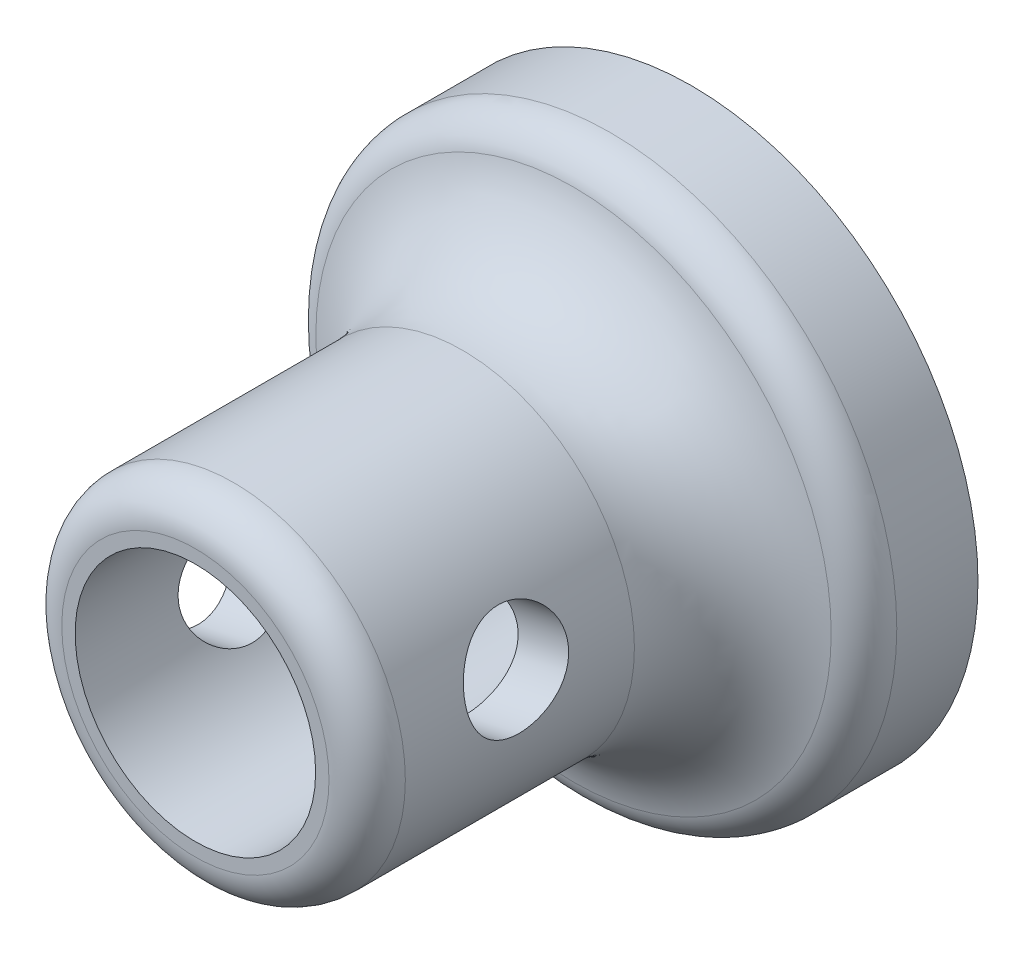
ISO-10303-21;
HEADER;
FILE_DESCRIPTION(('STEP AP214'),'2;1');
FILE_NAME('part.step','',(''),(''),'','','');
FILE_SCHEMA(('AUTOMOTIVE_DESIGN { 1 0 10303 214 1 1 1 1 }'));
ENDSEC;
DATA;
#1=APPLICATION_CONTEXT('core data for automotive mechanical design processes');
#2=APPLICATION_PROTOCOL_DEFINITION('international standard','automotive_design',2000,#1);
#3=PRODUCT_CONTEXT('',#1,'mechanical');
#4=PRODUCT('Part','Part','',(#3));
#5=PRODUCT_RELATED_PRODUCT_CATEGORY('part','',(#4));
#6=PRODUCT_DEFINITION_FORMATION('','',#4);
#7=PRODUCT_DEFINITION_CONTEXT('part definition',#1,'design');
#8=PRODUCT_DEFINITION('design','',#6,#7);
#9=PRODUCT_DEFINITION_SHAPE('','',#8);
#10=(LENGTH_UNIT() NAMED_UNIT(*) SI_UNIT(.MILLI.,.METRE.));
#11=(NAMED_UNIT(*) PLANE_ANGLE_UNIT() SI_UNIT($,.RADIAN.));
#12=(NAMED_UNIT(*) SI_UNIT($,.STERADIAN.) SOLID_ANGLE_UNIT());
#13=UNCERTAINTY_MEASURE_WITH_UNIT(LENGTH_MEASURE(1.E-05),#10,'distance_accuracy_value','');
#14=(GEOMETRIC_REPRESENTATION_CONTEXT(3) GLOBAL_UNCERTAINTY_ASSIGNED_CONTEXT((#13)) GLOBAL_UNIT_ASSIGNED_CONTEXT((#10,
#11,#12)) REPRESENTATION_CONTEXT('',''));
#15=CARTESIAN_POINT('',(0.,0.,0.));
#16=DIRECTION('',(0.,0.,1.));
#17=DIRECTION('',(1.,0.,0.));
#18=AXIS2_PLACEMENT_3D('',#15,#16,#17);
#19=CARTESIAN_POINT('',(18.1431082575943,29.9368359977339,3.));
#20=DIRECTION('',(0.,0.,-1.));
#21=DIRECTION('',(-1.,0.,0.));
#22=AXIS2_PLACEMENT_3D('',#19,#20,#21);
#23=CYLINDRICAL_SURFACE('',#22,7.5);
#24=CARTESIAN_POINT('',(18.1431082575943,29.9368359977339,2.12701665379258));
#25=DIRECTION('',(0.,0.,-1.));
#26=DIRECTION('',(-1.,0.,0.));
#27=AXIS2_PLACEMENT_3D('',#24,#25,#26);
#28=CIRCLE('',#27,7.5);
#29=CARTESIAN_POINT('',(10.6431082575943,29.9368359977339,2.12701665379258));
#30=VERTEX_POINT('',#29);
#31=EDGE_CURVE('E57',#30,#30,#28,.T.);
#32=ORIENTED_EDGE('',*,*,#31,.T.);
#33=EDGE_LOOP('',(#32));
#34=FACE_BOUND('',#33,.T.);
#35=CARTESIAN_POINT('',(18.1431082575943,29.9368359977339,0.));
#36=DIRECTION('',(0.,0.,1.));
#37=DIRECTION('',(1.,0.,0.));
#38=AXIS2_PLACEMENT_3D('',#35,#36,#37);
#39=CIRCLE('',#38,7.5);
#40=CARTESIAN_POINT('',(25.6431082575943,29.9368359977339,0.));
#41=VERTEX_POINT('',#40);
#42=EDGE_CURVE('E135',#41,#41,#39,.T.);
#43=ORIENTED_EDGE('',*,*,#42,.T.);
#44=EDGE_LOOP('',(#43));
#45=FACE_BOUND('',#44,.T.);
#46=ADVANCED_FACE('F39',(#34,#45),#23,.T.);
#47=CARTESIAN_POINT('',(18.1431082575943,29.9368359977339,0.));
#48=DIRECTION('',(0.,0.,1.));
#49=DIRECTION('',(1.,0.,0.));
#50=AXIS2_PLACEMENT_3D('',#47,#48,#49);
#51=PLANE('',#50);
#52=CARTESIAN_POINT('',(18.1431082575943,29.9368359977339,0.));
#53=DIRECTION('',(0.,0.,1.));
#54=DIRECTION('',(1.,0.,0.));
#55=AXIS2_PLACEMENT_3D('',#52,#53,#54);
#56=CIRCLE('',#55,1.65);
#57=CARTESIAN_POINT('',(19.7931082575943,29.9368359977339,0.));
#58=VERTEX_POINT('',#57);
#59=EDGE_CURVE('E141',#58,#58,#56,.F.);
#60=ORIENTED_EDGE('',*,*,#59,.F.);
#61=EDGE_LOOP('',(#60));
#62=FACE_BOUND('',#61,.T.);
#63=ORIENTED_EDGE('',*,*,#42,.F.);
#64=EDGE_LOOP('',(#63));
#65=FACE_BOUND('',#64,.T.);
#66=ADVANCED_FACE('F103',(#62,#65),#51,.F.);
#67=CARTESIAN_POINT('',(18.1431082575943,29.9368359977339,13.));
#68=DIRECTION('',(0.,0.,1.));
#69=DIRECTION('',(1.,0.,0.));
#70=AXIS2_PLACEMENT_3D('',#67,#68,#69);
#71=PLANE('',#70);
#72=CARTESIAN_POINT('',(18.1431082575943,29.9368359977339,13.));
#73=DIRECTION('',(0.,0.,1.));
#74=DIRECTION('',(1.,0.,0.));
#75=AXIS2_PLACEMENT_3D('',#72,#73,#74);
#76=CIRCLE('',#75,3.5);
#77=CARTESIAN_POINT('',(21.6431082575943,29.9368359977339,13.));
#78=VERTEX_POINT('',#77);
#79=EDGE_CURVE('E52',#78,#78,#76,.T.);
#80=ORIENTED_EDGE('',*,*,#79,.T.);
#81=EDGE_LOOP('',(#80));
#82=FACE_BOUND('',#81,.T.);
#83=CARTESIAN_POINT('',(18.1431082575943,29.9368359977339,13.));
#84=DIRECTION('',(0.,0.,1.));
#85=DIRECTION('',(1.,0.,0.));
#86=AXIS2_PLACEMENT_3D('',#83,#84,#85);
#87=CIRCLE('',#86,3.15);
#88=CARTESIAN_POINT('',(21.2931082575943,29.9368359977339,13.));
#89=VERTEX_POINT('',#88);
#90=EDGE_CURVE('E138',#89,#89,#87,.T.);
#91=ORIENTED_EDGE('',*,*,#90,.F.);
#92=EDGE_LOOP('',(#91));
#93=FACE_BOUND('',#92,.T.);
#94=ADVANCED_FACE('F95',(#82,#93),#71,.T.);
#95=CARTESIAN_POINT('',(18.1431082575943,29.9368359977339,13.));
#96=DIRECTION('',(0.,0.,-1.));
#97=DIRECTION('',(-1.,0.,0.));
#98=AXIS2_PLACEMENT_3D('',#95,#96,#97);
#99=CYLINDRICAL_SURFACE('',#98,4.5);
#100=CARTESIAN_POINT('',(22.620113793116,29.4824997402025,9.));
#101=CARTESIAN_POINT('',(22.6201143562412,29.4825007971587,9.07397509314816));
#102=CARTESIAN_POINT('',(22.6207736410553,29.4888655882915,9.14795930172962));
#103=CARTESIAN_POINT('',(22.6232213520881,29.5140568813195,9.29376472463275));
#104=CARTESIAN_POINT('',(22.6250101555754,29.5328875470225,9.36558520785132));
#105=CARTESIAN_POINT('',(22.629181332351,29.582216780074,9.50493125544456));
#106=CARTESIAN_POINT('',(22.6315627160945,29.6126959407143,9.57246374666978));
#107=CARTESIAN_POINT('',(22.6361563187062,29.6842503923314,9.70165974059577));
#108=CARTESIAN_POINT('',(22.6383685121861,29.7253272695483,9.763322362816));
#109=CARTESIAN_POINT('',(22.6417880907802,29.8181279539382,9.88097975151964));
#110=CARTESIAN_POINT('',(22.6429648462821,29.8701232696044,9.93676130815166));
#111=CARTESIAN_POINT('',(22.6432269896913,29.9824720933915,10.0391741561903));
#112=CARTESIAN_POINT('',(22.6423121089612,30.0428266741915,10.0858042714049));
#113=CARTESIAN_POINT('',(22.6374540341031,30.1715307361078,10.16951642985));
#114=CARTESIAN_POINT('',(22.6334486070153,30.2400197379852,10.2063810819985));
#115=CARTESIAN_POINT('',(22.621609053002,30.3819092480203,10.2680885331385));
#116=CARTESIAN_POINT('',(22.6137757525421,30.4553086930267,10.2929339248717));
#117=CARTESIAN_POINT('',(22.5941896931129,30.6025933256329,10.3291920009815));
#118=CARTESIAN_POINT('',(22.5825554658496,30.6764045532954,10.3409686148874));
#119=CARTESIAN_POINT('',(22.5553824982554,30.8242362165451,10.3519055921818));
#120=CARTESIAN_POINT('',(22.5398445786947,30.8982566049246,10.3510686054618));
#121=CARTESIAN_POINT('',(22.50591236693,31.0419237464229,10.3370464183113));
#122=CARTESIAN_POINT('',(22.4876248022935,31.1116347127572,10.3242553255711));
#123=CARTESIAN_POINT('',(22.4486549446758,31.2472749146427,10.2873317976051));
#124=CARTESIAN_POINT('',(22.4279725001029,31.3132039104066,10.2631986441516));
#125=CARTESIAN_POINT('',(22.3850212387639,31.4404109462665,10.2040091789233));
#126=CARTESIAN_POINT('',(22.3627367510017,31.5016258724203,10.1688289174735));
#127=CARTESIAN_POINT('',(22.3180599030227,31.6172000941239,10.0886419328146));
#128=CARTESIAN_POINT('',(22.2956675184485,31.6715577583788,10.0436328783329));
#129=CARTESIAN_POINT('',(22.2512900846311,31.7742510530419,9.94302202432357));
#130=CARTESIAN_POINT('',(22.2293540124488,31.822273767797,9.88707877287324));
#131=CARTESIAN_POINT('',(22.1883673209859,31.908680871256,9.76724098389895));
#132=CARTESIAN_POINT('',(22.1693169885249,31.9470643021403,9.7033456571497));
#133=CARTESIAN_POINT('',(22.1354097419241,32.0135985392966,9.56858447767591));
#134=CARTESIAN_POINT('',(22.1205947908925,32.0416476937818,9.49765765872337));
#135=CARTESIAN_POINT('',(22.0967009765957,32.0861965960057,9.35135351239901));
#136=CARTESIAN_POINT('',(22.0876202421538,32.1027001114811,9.2759776456189));
#137=CARTESIAN_POINT('',(22.0762640613854,32.1232529344876,9.12592587533465));
#138=CARTESIAN_POINT('',(22.0737475791079,32.1277435162817,9.05132859849541));
#139=CARTESIAN_POINT('',(22.0750515109018,32.1254027916992,8.90237438999112));
#140=CARTESIAN_POINT('',(22.0788710379262,32.118573070175,8.82801742614224));
#141=CARTESIAN_POINT('',(22.0923160214354,32.0941356786662,8.68366045982622));
#142=CARTESIAN_POINT('',(22.1017880698055,32.076812614811,8.61359745216283));
#143=CARTESIAN_POINT('',(22.1256258689326,32.0321142118936,8.47763847826657));
#144=CARTESIAN_POINT('',(22.1399923752596,32.0047373207452,8.41174315727348));
#145=CARTESIAN_POINT('',(22.17296998291,31.9397272062051,8.28403428233508));
#146=CARTESIAN_POINT('',(22.1916846588522,31.9018384270169,8.22237775111279));
#147=CARTESIAN_POINT('',(22.2317768379106,31.816992096829,8.10662570443728));
#148=CARTESIAN_POINT('',(22.2531549779676,31.77003237512,8.05253200414849));
#149=CARTESIAN_POINT('',(22.2979915212476,31.6660736604892,7.95133763476674));
#150=CARTESIAN_POINT('',(22.3214979847729,31.6087626675275,7.90457793391171));
#151=CARTESIAN_POINT('',(22.3682974174728,31.4866886329818,7.82192996907502));
#152=CARTESIAN_POINT('',(22.3915903971942,31.4219259617016,7.78604116519668));
#153=CARTESIAN_POINT('',(22.4363501774861,31.2870503327077,7.72649997248853));
#154=CARTESIAN_POINT('',(22.4578295713196,31.2169820350454,7.70275618545692));
#155=CARTESIAN_POINT('',(22.4979581021844,31.0729962192332,7.66794517299862));
#156=CARTESIAN_POINT('',(22.5166080476623,30.999079808727,7.65687432064642));
#157=CARTESIAN_POINT('',(22.54957646903,30.8525128917909,7.64799926035095));
#158=CARTESIAN_POINT('',(22.5640340911253,30.7799232542382,7.64970057413295));
#159=CARTESIAN_POINT('',(22.589164893014,30.6353783645504,7.66513946924921));
#160=CARTESIAN_POINT('',(22.5998382873355,30.5634230766798,7.6788763681324));
#161=CARTESIAN_POINT('',(22.6173222191465,30.4230111973071,7.71769049525966));
#162=CARTESIAN_POINT('',(22.624173006717,30.3545253328211,7.74264436258411));
#163=CARTESIAN_POINT('',(22.6345492633876,30.2220979273408,7.80307372305647));
#164=CARTESIAN_POINT('',(22.6380741856289,30.1581571352724,7.83855094525757));
#165=CARTESIAN_POINT('',(22.6424861962661,30.0345484298115,7.92033611168703));
#166=CARTESIAN_POINT('',(22.6432852722671,29.9750827010964,7.96695428700069));
#167=CARTESIAN_POINT('',(22.6428663044767,29.8644002403856,8.06913934949952));
#168=CARTESIAN_POINT('',(22.6416476787701,29.8131858928039,8.12470881410834));
#169=CARTESIAN_POINT('',(22.6380924258881,29.7191129367651,8.24520670047946));
#170=CARTESIAN_POINT('',(22.6357235598252,29.6765488602746,8.31036469805139));
#171=CARTESIAN_POINT('',(22.6308765820105,29.6032292677179,8.44699965674492));
#172=CARTESIAN_POINT('',(22.6283985233911,29.5724680776559,8.51847356124108));
#173=CARTESIAN_POINT('',(22.6244192019949,29.5265623391239,8.65776638844565));
#174=CARTESIAN_POINT('',(22.6228414020508,29.5100910626556,8.72514778223789));
#175=CARTESIAN_POINT('',(22.6206885348768,29.4880603628649,8.8616837002462));
#176=CARTESIAN_POINT('',(22.6201132666289,29.4824987520138,8.93083786618072));
#177=CARTESIAN_POINT('',(22.620113793116,29.4824997402025,9.));
#178=B_SPLINE_CURVE_WITH_KNOTS('',3,(#100,#101,#102,#103,#104,#105,#106,#107,#108,#109,#110,
#111,#112,#113,#114,#115,#116,#117,#118,#119,#120,#121,#122,#123,#124,#125,#126,#127,#128,#129,
#130,#131,#132,#133,#134,#135,#136,#137,#138,#139,#140,#141,#142,#143,#144,#145,#146,#147,#148,
#149,#150,#151,#152,#153,#154,#155,#156,#157,#158,#159,#160,#161,#162,#163,#164,#165,#166,#167,
#168,#169,#170,#171,#172,#173,#174,#175,#176,#177),.UNSPECIFIED.,.T.,.F.,(4,2,2,2,2,2,2,2,2,2,2,
2,2,2,2,2,2,2,2,2,2,2,2,2,2,2,2,2,2,2,2,2,2,2,2,2,2,2,4),(0.,0.221670149323986,0.4434143775201,
0.664790773019575,0.886200322833094,1.11395835007186,1.34174563084146,1.5742434534628,
1.80669110029089,2.03248926134602,2.25823998691296,2.47680113391792,2.69537612301339,
2.91649688402108,3.13767014931747,3.3673693232095,3.59709131242677,3.8290161442164,
4.0608652556557,4.28407272711279,4.50724895196649,4.72462735444935,4.94203932941209,
5.1652865862845,5.3885873333603,5.62031555490542,5.85203226591782,6.08197852632893,
6.31185896089515,6.53288673520098,6.75390197742979,6.97254387184997,7.19122171042241,
7.4168966434904,7.64263667366901,7.87510475702232,8.1074609456755,8.31475038471703,
8.52199825530204),.UNSPECIFIED.);
#179=CARTESIAN_POINT('',(22.620113793116,29.4824997402025,9.));
#180=VERTEX_POINT('',#179);
#181=EDGE_CURVE('E80',#180,#180,#178,.T.);
#182=ORIENTED_EDGE('',*,*,#181,.T.);
#183=EDGE_LOOP('',(#182));
#184=FACE_BOUND('',#183,.T.);
#185=CARTESIAN_POINT('',(13.6431082575943,29.9368359977339,9.99747659943007));
#186=CARTESIAN_POINT('',(13.6431089684939,29.8802745863279,10.0479942850589));
#187=CARTESIAN_POINT('',(13.6441799808721,29.8195986517249,10.0939203687737));
#188=CARTESIAN_POINT('',(13.64933429864,29.6917109550255,10.1753409406959));
#189=CARTESIAN_POINT('',(13.6534178007127,29.6244987664314,10.2108347475768));
#190=CARTESIAN_POINT('',(13.6652709751039,29.4853367038065,10.2703540893971));
#191=CARTESIAN_POINT('',(13.6730463133431,29.4133796944938,10.2943618824781));
#192=CARTESIAN_POINT('',(13.692630072223,29.266992757713,10.3299870597882));
#193=CARTESIAN_POINT('',(13.704437503033,29.1925634412112,10.3416074820865));
#194=CARTESIAN_POINT('',(13.7316246633594,29.0456354087142,10.3518829752343));
#195=CARTESIAN_POINT('',(13.7468949278644,28.9731410856625,10.3508924995526));
#196=CARTESIAN_POINT('',(13.7807038060381,28.8301168059407,10.3368407969596));
#197=CARTESIAN_POINT('',(13.7992422895655,28.7595867711816,10.3237800506015));
#198=CARTESIAN_POINT('',(13.8385200813683,28.6232537355524,10.2862774304427));
#199=CARTESIAN_POINT('',(13.8592306056055,28.5574045065308,10.2619727043466));
#200=CARTESIAN_POINT('',(13.9019726495458,28.4311073688529,10.2027978183628));
#201=CARTESIAN_POINT('',(13.9240043832574,28.3706603392118,10.1679259430868));
#202=CARTESIAN_POINT('',(13.9688557451952,28.2546932558646,10.0873468122804));
#203=CARTESIAN_POINT('',(13.9916784994717,28.1993859088838,10.0413352957222));
#204=CARTESIAN_POINT('',(14.0359969196566,28.0970666401674,9.94031332019816));
#205=CARTESIAN_POINT('',(14.057492271155,28.0500566788972,9.88530074040648));
#206=CARTESIAN_POINT('',(14.0983136703683,27.9640264443221,9.76581698798401));
#207=CARTESIAN_POINT('',(14.1175532365797,27.9252945908317,9.70110794046113));
#208=CARTESIAN_POINT('',(14.1515496502666,27.8586476981536,9.5652552005312));
#209=CARTESIAN_POINT('',(14.1663071540571,27.8307310751104,9.4941124522025));
#210=CARTESIAN_POINT('',(14.1898454741138,27.7868762175049,9.34865978172575));
#211=CARTESIAN_POINT('',(14.1987257981773,27.7707380484618,9.27442648838611));
#212=CARTESIAN_POINT('',(14.2100947020756,27.7501610353007,9.12388533354684));
#213=CARTESIAN_POINT('',(14.2125852486939,27.7457185912093,9.04757811771386));
#214=CARTESIAN_POINT('',(14.210976295186,27.7486090338599,8.89839418768767));
#215=CARTESIAN_POINT('',(14.2071421055973,27.7554678412955,8.82550478873257));
#216=CARTESIAN_POINT('',(14.1937226561878,27.7798602599689,8.68208544315806));
#217=CARTESIAN_POINT('',(14.184137176499,27.7973942793132,8.61155558685122));
#218=CARTESIAN_POINT('',(14.1600028619818,27.8426715432602,8.47468143187778));
#219=CARTESIAN_POINT('',(14.1454487228008,27.8704257009958,8.40834169648798));
#220=CARTESIAN_POINT('',(14.1124956167448,27.9354648507824,8.28154984833583));
#221=CARTESIAN_POINT('',(14.0940957781136,27.9727520042337,8.22109907506629));
#222=CARTESIAN_POINT('',(14.053922267511,28.0577795013529,8.10515241803855));
#223=CARTESIAN_POINT('',(14.0320409646073,28.1058866741597,8.04996254803356));
#224=CARTESIAN_POINT('',(13.9870084460462,28.2105464953828,7.9488769528134));
#225=CARTESIAN_POINT('',(13.9638570484896,28.2671003555175,7.90298256330933));
#226=CARTESIAN_POINT('',(13.9173441303347,28.3885414419203,7.82099160532573));
#227=CARTESIAN_POINT('',(13.8939865843144,28.4535628815928,7.78509090315768));
#228=CARTESIAN_POINT('',(13.8489553425105,28.5894803297895,7.72539074698746));
#229=CARTESIAN_POINT('',(13.827281250769,28.6603749487526,7.70158844002874));
#230=CARTESIAN_POINT('',(13.7874492474762,28.8038706706647,7.66745869441301));
#231=CARTESIAN_POINT('',(13.7692053350636,28.8763567143746,7.65674831141171));
#232=CARTESIAN_POINT('',(13.736259717131,29.0228777037513,7.64791443332954));
#233=CARTESIAN_POINT('',(13.7215573142248,29.0969123413467,7.64978845805287));
#234=CARTESIAN_POINT('',(13.6964832404394,29.2420088537079,7.66579445002937));
#235=CARTESIAN_POINT('',(13.6859927112358,29.3130923243338,7.67954919198141));
#236=CARTESIAN_POINT('',(13.6686885448577,29.4525733910861,7.71833570216932));
#237=CARTESIAN_POINT('',(13.661875173145,29.5209707929692,7.74336828433669));
#238=CARTESIAN_POINT('',(13.6514956479732,29.6541018366701,7.80434006198601));
#239=CARTESIAN_POINT('',(13.6479747581297,29.7187732559358,7.84042248434898));
#240=CARTESIAN_POINT('',(13.6436926915252,29.8417101205226,7.9223505409335));
#241=CARTESIAN_POINT('',(13.6429321810967,29.8999740158302,7.96819852965382));
#242=CARTESIAN_POINT('',(13.6433598909419,30.0106393996733,8.07043769905891));
#243=CARTESIAN_POINT('',(13.6446242611798,30.0627288415953,8.1271668224542));
#244=CARTESIAN_POINT('',(13.6482386808733,30.1567632083393,8.24847111533149));
#245=CARTESIAN_POINT('',(13.6505888191424,30.1987073028654,8.31304692633769));
#246=CARTESIAN_POINT('',(13.6554065141402,30.2713099706215,8.44889581337773));
#247=CARTESIAN_POINT('',(13.6578748139382,30.3018823207104,8.52021511226407));
#248=CARTESIAN_POINT('',(13.6620572654498,30.3500848853834,8.66711791937368));
#249=CARTESIAN_POINT('',(13.6637716711021,30.3677194592152,8.74269998205155));
#250=CARTESIAN_POINT('',(13.6658572614019,30.3888675970977,8.89287675490555));
#251=CARTESIAN_POINT('',(13.6662773888279,30.3928962570167,8.96739836152642));
#252=CARTESIAN_POINT('',(13.6657917462834,30.3881040670135,9.11601796868748));
#253=CARTESIAN_POINT('',(13.6648861097211,30.3792845099756,9.19011601109667));
#254=CARTESIAN_POINT('',(13.6620497771675,30.3495430434168,9.33394419944489));
#255=CARTESIAN_POINT('',(13.6601442203582,30.3289168592557,9.40373650663919));
#256=CARTESIAN_POINT('',(13.6558746836512,30.2765712495691,9.53900419078804));
#257=CARTESIAN_POINT('',(13.6535106799855,30.2448512488242,9.60447934368693));
#258=CARTESIAN_POINT('',(13.6491047611207,30.1718788821016,9.72867173008993));
#259=CARTESIAN_POINT('',(13.6470588865531,30.1307626774359,9.78746907391886));
#260=CARTESIAN_POINT('',(13.6440602158732,30.0399321017978,9.89803374972422));
#261=CARTESIAN_POINT('',(13.6431075866754,29.9902164192068,9.94980000714447));
#262=CARTESIAN_POINT('',(13.6431082575943,29.9368359977339,9.99747659943007));
#263=B_SPLINE_CURVE_WITH_KNOTS('',3,(#185,#186,#187,#188,#189,#190,#191,#192,#193,#194,#195,
#196,#197,#198,#199,#200,#201,#202,#203,#204,#205,#206,#207,#208,#209,#210,#211,#212,#213,#214,
#215,#216,#217,#218,#219,#220,#221,#222,#223,#224,#225,#226,#227,#228,#229,#230,#231,#232,#233,
#234,#235,#236,#237,#238,#239,#240,#241,#242,#243,#244,#245,#246,#247,#248,#249,#250,#251,#252,
#253,#254,#255,#256,#257,#258,#259,#260,#261,#262),.UNSPECIFIED.,.T.,.F.,(4,2,2,2,2,2,2,2,2,2,2,
2,2,2,2,2,2,2,2,2,2,2,2,2,2,2,2,2,2,2,2,2,2,2,2,2,2,2,4),(0.,0.227266479702176,
0.454547798758759,0.682179063170794,0.909754486942853,1.13094792933329,1.35213256573454,
1.5706877013338,1.78927833448694,2.01469260143289,2.240160057061,2.47252509704189,
2.70485609503797,2.93314532397944,3.16136427670577,3.38025108128248,3.59914625428968,
3.81827584605447,4.03745516483463,4.26564835690246,4.49387431589135,4.72630059415466,
4.95867203786711,5.18407001635574,5.40942357362712,5.62787443637868,5.84634106744447,
6.0677687397517,6.28924985929355,6.51925762299535,6.74928420418581,6.9810209683671,
7.21267961537802,7.43546339289291,7.65822475377873,7.87563648372392,8.09305948823657,
8.30751185910732,8.52199696779891),.UNSPECIFIED.);
#264=CARTESIAN_POINT('',(13.6431082575943,29.9368359977339,9.99747659943007));
#265=VERTEX_POINT('',#264);
#266=EDGE_CURVE('E86',#265,#265,#263,.T.);
#267=ORIENTED_EDGE('',*,*,#266,.T.);
#268=EDGE_LOOP('',(#267));
#269=FACE_BOUND('',#268,.T.);
#270=CARTESIAN_POINT('',(18.1431082575943,29.9368359977339,12.));
#271=DIRECTION('',(0.,0.,1.));
#272=DIRECTION('',(1.,0.,0.));
#273=AXIS2_PLACEMENT_3D('',#270,#271,#272);
#274=CIRCLE('',#273,4.5);
#275=CARTESIAN_POINT('',(22.6431082575943,29.9368359977339,12.));
#276=VERTEX_POINT('',#275);
#277=EDGE_CURVE('E10',#276,#276,#274,.F.);
#278=ORIENTED_EDGE('',*,*,#277,.T.);
#279=EDGE_LOOP('',(#278));
#280=FACE_BOUND('',#279,.T.);
#281=CARTESIAN_POINT('',(18.1431082575943,29.9368359977339,6.));
#282=DIRECTION('',(0.,0.,1.));
#283=DIRECTION('',(1.,0.,0.));
#284=AXIS2_PLACEMENT_3D('',#281,#282,#283);
#285=CIRCLE('',#284,4.5);
#286=CARTESIAN_POINT('',(22.6431082575943,29.9368359977339,6.));
#287=VERTEX_POINT('',#286);
#288=EDGE_CURVE('E127',#287,#287,#285,.T.);
#289=ORIENTED_EDGE('',*,*,#288,.T.);
#290=EDGE_LOOP('',(#289));
#291=FACE_BOUND('',#290,.T.);
#292=ADVANCED_FACE('F91',(#184,#269,#280,#291),#99,.T.);
#293=CARTESIAN_POINT('',(18.1431082575943,29.9368359977339,13.));
#294=DIRECTION('',(0.,0.,-1.));
#295=DIRECTION('',(-1.,0.,0.));
#296=AXIS2_PLACEMENT_3D('',#293,#294,#295);
#297=CYLINDRICAL_SURFACE('',#296,3.15);
#298=CARTESIAN_POINT('',(14.9931082575943,29.9368359977339,10.1903802701411));
#299=CARTESIAN_POINT('',(14.9931102999461,29.8732132676432,10.223709316068));
#300=CARTESIAN_POINT('',(14.9950505986868,29.8070080103212,10.2522952056587));
#301=CARTESIAN_POINT('',(15.0035908596131,29.6711896883862,10.298976753954));
#302=CARTESIAN_POINT('',(15.0101974703728,29.6015718934447,10.3170573776528));
#303=CARTESIAN_POINT('',(15.0284677580875,29.4608646789268,10.3419887286657));
#304=CARTESIAN_POINT('',(15.0401389585906,29.3897732203883,10.3488226761549));
#305=CARTESIAN_POINT('',(15.0684052478466,29.2484373848096,10.350897276917));
#306=CARTESIAN_POINT('',(15.0849980980908,29.1781926377431,10.3461431936816));
#307=CARTESIAN_POINT('',(15.121910794454,29.0425961940166,10.3255713858531));
#308=CARTESIAN_POINT('',(15.1421093683967,28.9771618103116,10.3100766535523));
#309=CARTESIAN_POINT('',(15.1855509156751,28.8506344207,10.268964609834));
#310=CARTESIAN_POINT('',(15.2087946047318,28.7895424406515,10.2433449157911));
#311=CARTESIAN_POINT('',(15.257927086223,28.6709397776286,10.181772770192));
#312=CARTESIAN_POINT('',(15.2838794442189,28.6136251792924,10.1454945354505));
#313=CARTESIAN_POINT('',(15.3362120939258,28.5059539075079,10.0640100036181));
#314=CARTESIAN_POINT('',(15.3625925628893,28.4556002027075,10.0187999171584));
#315=CARTESIAN_POINT('',(15.4161128865017,28.3590951722122,9.91675925546413));
#316=CARTESIAN_POINT('',(15.4431606668415,28.313544608485,9.85931048806948));
#317=CARTESIAN_POINT('',(15.4938076812394,28.2321333885885,9.7365274257616));
#318=CARTESIAN_POINT('',(15.5174060908371,28.1962750472976,9.67119125241085));
#319=CARTESIAN_POINT('',(15.5593305516761,28.1346127458998,9.53314268948219));
#320=CARTESIAN_POINT('',(15.5775786007019,28.1089557625159,9.46034024693514));
#321=CARTESIAN_POINT('',(15.6063302001096,28.0692519907563,9.31019757533648));
#322=CARTESIAN_POINT('',(15.6168407176798,28.0551947561121,9.23286149647984));
#323=CARTESIAN_POINT('',(15.6283147965662,28.0398921889111,9.08272004634911));
#324=CARTESIAN_POINT('',(15.6299937043849,28.037686545542,9.0100664814923));
#325=CARTESIAN_POINT('',(15.6255449150962,28.0435878033745,8.86542876920287));
#326=CARTESIAN_POINT('',(15.6194183116316,28.051693259871,8.79344452941338));
#327=CARTESIAN_POINT('',(15.6005182889504,28.0772745730684,8.65574778421628));
#328=CARTESIAN_POINT('',(15.5880786912904,28.0942810516217,8.58990014599403));
#329=CARTESIAN_POINT('',(15.5578952996415,28.1368771427343,8.46233549165208));
#330=CARTESIAN_POINT('',(15.5401500293559,28.1624691444468,8.40061963105168));
#331=CARTESIAN_POINT('',(15.4994660756599,28.2236264775347,8.27868807451138));
#332=CARTESIAN_POINT('',(15.4762643231326,28.2597330341089,8.21883219601746));
#333=CARTESIAN_POINT('',(15.4271903802773,28.3404278071716,8.10635109748906));
#334=CARTESIAN_POINT('',(15.4013169277564,28.3850200410163,8.05372932268774));
#335=CARTESIAN_POINT('',(15.3466048847592,28.4857685103556,7.9530557577431));
#336=CARTESIAN_POINT('',(15.3176913584886,28.5425506765421,7.905667553977));
#337=CARTESIAN_POINT('',(15.2608650551166,28.6641724693107,7.8218758661977));
#338=CARTESIAN_POINT('',(15.2329521533182,28.729011087375,7.78547100922571));
#339=CARTESIAN_POINT('',(15.1805704826976,28.8639880168436,7.72554238706371));
#340=CARTESIAN_POINT('',(15.1560451353999,28.9339982237519,7.70178112896172));
#341=CARTESIAN_POINT('',(15.1113800197387,29.0784508990138,7.667121220823));
#342=CARTESIAN_POINT('',(15.0912375848393,29.1528906371613,7.65621473208541));
#343=CARTESIAN_POINT('',(15.0577240840396,29.2980600736766,7.64809924687948));
#344=CARTESIAN_POINT('',(15.0439565961178,29.3686455537662,7.6499182575943));
#345=CARTESIAN_POINT('',(15.0214296211514,29.5094008067714,7.66490085463192));
#346=CARTESIAN_POINT('',(15.0126697510674,29.5795706110761,7.67806357306633));
#347=CARTESIAN_POINT('',(15.00012238538,29.7160458586902,7.71481334315896));
#348=CARTESIAN_POINT('',(14.9962393233295,29.7824004345599,7.73818753628852));
#349=CARTESIAN_POINT('',(14.9925560875365,29.9110288426966,7.79450035550992));
#350=CARTESIAN_POINT('',(14.992756868607,29.9733017172369,7.82744121653859));
#351=CARTESIAN_POINT('',(14.9964929991104,30.0958794650638,7.90419707965138));
#352=CARTESIAN_POINT('',(15.0002266837405,30.1558449676796,7.94854381568184));
#353=CARTESIAN_POINT('',(15.010070022512,30.2681274530824,8.04585496528117));
#354=CARTESIAN_POINT('',(15.0161809303462,30.3204403800123,8.09882391742225));
#355=CARTESIAN_POINT('',(15.0298247341782,30.419129114165,8.21594038840492));
#356=CARTESIAN_POINT('',(15.0374239020023,30.464904812631,8.28058839950458));
#357=CARTESIAN_POINT('',(15.0520236845114,30.5445729939757,8.41691126212507));
#358=CARTESIAN_POINT('',(15.059024455735,30.5784685918856,8.48858426533552));
#359=CARTESIAN_POINT('',(15.0706581150524,30.6320242570857,8.63496094602848));
#360=CARTESIAN_POINT('',(15.0753526505968,30.6520615627288,8.70952057752173));
#361=CARTESIAN_POINT('',(15.0815790051972,30.6782734334692,8.86114829270059));
#362=CARTESIAN_POINT('',(15.0831132799977,30.6844587628505,8.93821438135033));
#363=CARTESIAN_POINT('',(15.0826835952195,30.6826873322882,9.08529082038846));
#364=CARTESIAN_POINT('',(15.0810183248014,30.6759381996436,9.15531972335324));
#365=CARTESIAN_POINT('',(15.075108232488,30.6510049707577,9.29318558873972));
#366=CARTESIAN_POINT('',(15.0708633283911,30.6328205101222,9.36102248123915));
#367=CARTESIAN_POINT('',(15.0606229828806,30.5859522861719,9.49253064032278));
#368=CARTESIAN_POINT('',(15.0546335185566,30.5573042885632,9.55621523626327));
#369=CARTESIAN_POINT('',(15.0419719894604,30.4905549053651,9.67838808276881));
#370=CARTESIAN_POINT('',(15.0352993369767,30.4524453396399,9.73687177708087));
#371=CARTESIAN_POINT('',(15.0218855808405,30.3641896793113,9.85239898835284));
#372=CARTESIAN_POINT('',(15.0151900242661,30.3132799839146,9.90886395678522));
#373=CARTESIAN_POINT('',(15.0038975401614,30.2031165074626,10.0130481671098));
#374=CARTESIAN_POINT('',(14.9992965334467,30.1438792417329,10.0607842991297));
#375=CARTESIAN_POINT('',(14.9953565583146,30.0580849197158,10.1194283239079));
#376=CARTESIAN_POINT('',(14.9945283756841,30.0344293861019,10.1346033240437));
#377=CARTESIAN_POINT('',(14.9934037779994,29.9862599630836,10.1635548360569));
#378=CARTESIAN_POINT('',(14.9931074579614,29.9617459211057,10.1773310976376));
#379=CARTESIAN_POINT('',(14.9931082575943,29.9368359977339,10.1903802701411));
#380=B_SPLINE_CURVE_WITH_KNOTS('',3,(#298,#299,#300,#301,#302,#303,#304,#305,#306,#307,#308,
#309,#310,#311,#312,#313,#314,#315,#316,#317,#318,#319,#320,#321,#322,#323,#324,#325,#326,#327,
#328,#329,#330,#331,#332,#333,#334,#335,#336,#337,#338,#339,#340,#341,#342,#343,#344,#345,#346,
#347,#348,#349,#350,#351,#352,#353,#354,#355,#356,#357,#358,#359,#360,#361,#362,#363,#364,#365,
#366,#367,#368,#369,#370,#371,#372,#373,#374,#375,#376,#377,#378,#379),.UNSPECIFIED.,.T.,.F.,(4,
2,2,2,2,2,2,2,2,2,2,2,2,2,2,2,2,2,2,2,2,2,2,2,2,2,2,2,2,2,2,2,2,2,2,2,2,2,2,2,4),(0.,
0.215371954980912,0.431051393154339,0.647052330136702,0.862955173899661,1.07263209017435,
1.28235837743291,1.49931524856291,1.71636436281924,1.94973540170888,2.183162129498,
2.4198396693578,2.65630383358105,2.87328210404809,3.09022997668048,3.2967446009799,
3.50331674127458,3.72334981351539,3.94348731588041,4.18057024762913,4.41762353084774,
4.65005107796544,4.88233681980285,5.09708495222221,5.31181665607438,5.52227124250676,
5.73277503432513,5.95584444437429,6.17903165593587,6.41660616663915,6.65411833724638,
6.88487960297263,7.11546148324765,7.32555737183917,7.53565995561171,7.74505100184067,
7.95462371441831,8.18261944062646,8.41016922008784,8.49447777969649,8.57880139937391),.UNSPECIFIED.);
#381=CARTESIAN_POINT('',(14.9931082575943,29.9368359977339,10.1903802701411));
#382=VERTEX_POINT('',#381);
#383=EDGE_CURVE('E43',#382,#382,#380,.T.);
#384=ORIENTED_EDGE('',*,*,#383,.F.);
#385=EDGE_LOOP('',(#384));
#386=FACE_BOUND('',#385,.T.);
#387=CARTESIAN_POINT('',(21.2033056976846,29.1900484592298,9.));
#388=CARTESIAN_POINT('',(21.2033123331083,29.1900586648814,9.07179203974133));
#389=CARTESIAN_POINT('',(21.2048400353248,29.1962497182343,9.14369232747785));
#390=CARTESIAN_POINT('',(21.2106517232002,29.220718831068,9.28540499676614));
#391=CARTESIAN_POINT('',(21.2149429892816,29.2390288206157,9.35521135212466));
#392=CARTESIAN_POINT('',(21.2253896481857,29.2867356099237,9.49042434761806));
#393=CARTESIAN_POINT('',(21.2315371202108,29.3160854288203,9.55584826680994));
#394=CARTESIAN_POINT('',(21.2445373632063,29.3847019420582,9.68113613649208));
#395=CARTESIAN_POINT('',(21.2513899955786,29.4239666898347,9.74100117518709));
#396=CARTESIAN_POINT('',(21.2649255226369,29.5138244942902,9.85745242405488));
#397=CARTESIAN_POINT('',(21.2715737595632,29.5649545860029,9.91362845773381));
#398=CARTESIAN_POINT('',(21.2827481359544,29.6755863489937,10.0173161991604));
#399=CARTESIAN_POINT('',(21.2872734302395,29.735091342228,10.0648244515241));
#400=CARTESIAN_POINT('',(21.2929521272611,29.8638843039658,10.1519635541722));
#401=CARTESIAN_POINT('',(21.2939394938036,29.9334979080979,10.1911271356175));
#402=CARTESIAN_POINT('',(21.2907652361011,30.0781821345047,10.2572839027943));
#403=CARTESIAN_POINT('',(21.2866060267331,30.1532501818925,10.2842827883393));
#404=CARTESIAN_POINT('',(21.2726926650068,30.302192978715,10.323839259505));
#405=CARTESIAN_POINT('',(21.2632568575722,30.3759085572793,10.3371057292346));
#406=CARTESIAN_POINT('',(21.2388781984814,30.5236078226104,10.3511172153549));
#407=CARTESIAN_POINT('',(21.2239377210617,30.5975913801924,10.3518676236403));
#408=CARTESIAN_POINT('',(21.19015077949,30.7386834022754,10.3411843880488));
#409=CARTESIAN_POINT('',(21.1716173446412,30.8059280042669,10.330531290023));
#410=CARTESIAN_POINT('',(21.1309834842592,30.9367329666784,10.2986891691053));
#411=CARTESIAN_POINT('',(21.1088827952067,31.000293054445,10.277499367608));
#412=CARTESIAN_POINT('',(21.061908815014,31.1232182864513,10.2249420346235));
#413=CARTESIAN_POINT('',(21.0369982709486,31.1825043526853,10.1934237184427));
#414=CARTESIAN_POINT('',(20.9860810163695,31.2947047633271,10.1212571900899));
#415=CARTESIAN_POINT('',(20.9600739147864,31.3476168081478,10.0806056979608));
#416=CARTESIAN_POINT('',(20.9065604835131,31.4499145039647,9.98783572199136));
#417=CARTESIAN_POINT('',(20.8790855309455,31.4987499141898,9.93509150859398));
#418=CARTESIAN_POINT('',(20.8265598727467,31.5873651593718,9.82138372576544));
#419=CARTESIAN_POINT('',(20.8015102161043,31.6271410858922,9.76041662681346));
#420=CARTESIAN_POINT('',(20.7550276184109,31.6981560119895,9.62919905646493));
#421=CARTESIAN_POINT('',(20.7337598695236,31.7290308222147,9.55869113443951));
#422=CARTESIAN_POINT('',(20.6982088603245,31.7793673176642,9.41206994614886));
#423=CARTESIAN_POINT('',(20.6839202714298,31.79883771242,9.33596100750555));
#424=CARTESIAN_POINT('',(20.66471206039,31.8247605504148,9.18577224199478));
#425=CARTESIAN_POINT('',(20.6592253724931,31.8320026622733,9.11190195873212));
#426=CARTESIAN_POINT('',(20.6564617129317,31.8356679864171,8.96375296119587));
#427=CARTESIAN_POINT('',(20.6591816151748,31.8320953183169,8.88947441320021));
#428=CARTESIAN_POINT('',(20.6720273553529,31.8149111500967,8.74806184181678));
#429=CARTESIAN_POINT('',(20.6816256886468,31.8020141377903,8.68078991683315));
#430=CARTESIAN_POINT('',(20.70669996926,31.7673962547001,8.5497095356332));
#431=CARTESIAN_POINT('',(20.722177344344,31.7456732403734,8.48590192505451));
#432=CARTESIAN_POINT('',(20.7584748919893,31.6928043593388,8.36045554936949));
#433=CARTESIAN_POINT('',(20.7794981043604,31.6612898638036,8.2990317051816));
#434=CARTESIAN_POINT('',(20.8248735383275,31.5898406492679,8.1826421825184));
#435=CARTESIAN_POINT('',(20.8492272559306,31.549902141945,8.12767942700529));
#436=CARTESIAN_POINT('',(20.9018055351754,31.4583833233171,8.02078698349835));
#437=CARTESIAN_POINT('',(20.9301824989457,31.4060921131759,7.96953814327283));
#438=CARTESIAN_POINT('',(20.9868597142205,31.2931421198725,7.87718959320282));
#439=CARTESIAN_POINT('',(21.0151599577614,31.2324824995943,7.83609089985554));
#440=CARTESIAN_POINT('',(21.069876462244,31.1036451329714,7.76516278967528));
#441=CARTESIAN_POINT('',(21.0962827843243,31.0354319150311,7.73538972950171));
#442=CARTESIAN_POINT('',(21.1452668868866,30.8934790010462,7.68863259049895));
#443=CARTESIAN_POINT('',(21.1678470857643,30.8197428387433,7.67164040966204));
#444=CARTESIAN_POINT('',(21.2063511695743,30.674580271917,7.65199014407337));
#445=CARTESIAN_POINT('',(21.2226413254499,30.6033799370144,7.64837378489008));
#446=CARTESIAN_POINT('',(21.250146217795,30.460392439219,7.65296797931014));
#447=CARTESIAN_POINT('',(21.2613619374998,30.3886053927558,7.66117624045474));
#448=CARTESIAN_POINT('',(21.278309971166,30.2494636299278,7.6884990916241));
#449=CARTESIAN_POINT('',(21.2842397031008,30.1820454002422,7.70717428533945));
#450=CARTESIAN_POINT('',(21.2917458987167,30.0505205052547,7.75440722872897));
#451=CARTESIAN_POINT('',(21.2933215606806,29.9864144519578,7.78296679732932));
#452=CARTESIAN_POINT('',(21.2928376923784,29.8602459827444,7.85060566012319));
#453=CARTESIAN_POINT('',(21.2906090258735,29.7984102548672,7.89010546736101));
#454=CARTESIAN_POINT('',(21.2832913619921,29.6815213155669,7.97790596824713));
#455=CARTESIAN_POINT('',(21.2782012312395,29.6264708021894,8.02621014402576));
#456=CARTESIAN_POINT('',(21.2659951593817,29.5207702424316,8.13437595778368));
#457=CARTESIAN_POINT('',(21.2587589337482,29.4707302090851,8.19482220744656));
#458=CARTESIAN_POINT('',(21.2441090004343,29.3815480490568,8.32334333192865));
#459=CARTESIAN_POINT('',(21.2366951921678,29.3424122652356,8.3914226146323));
#460=CARTESIAN_POINT('',(21.2233484179585,29.276724363947,8.53341621288813));
#461=CARTESIAN_POINT('',(21.2174128000003,29.2501496326613,8.6073197608123));
#462=CARTESIAN_POINT('',(21.2084055746911,29.2109754131417,8.75875966193316));
#463=CARTESIAN_POINT('',(21.2053243663551,29.1983290486606,8.83628290885938));
#464=CARTESIAN_POINT('',(21.2035422922077,29.1910232249061,8.94275896042898));
#465=CARTESIAN_POINT('',(21.2033030516198,29.1900443894347,8.97137087318114));
#466=CARTESIAN_POINT('',(21.2033056976846,29.1900484592298,9.));
#467=B_SPLINE_CURVE_WITH_KNOTS('',3,(#387,#388,#389,#390,#391,#392,#393,#394,#395,#396,#397,
#398,#399,#400,#401,#402,#403,#404,#405,#406,#407,#408,#409,#410,#411,#412,#413,#414,#415,#416,
#417,#418,#419,#420,#421,#422,#423,#424,#425,#426,#427,#428,#429,#430,#431,#432,#433,#434,#435,
#436,#437,#438,#439,#440,#441,#442,#443,#444,#445,#446,#447,#448,#449,#450,#451,#452,#453,#454,
#455,#456,#457,#458,#459,#460,#461,#462,#463,#464,#465,#466),.UNSPECIFIED.,.T.,.F.,(4,2,2,2,2,2,
2,2,2,2,2,2,2,2,2,2,2,2,2,2,2,2,2,2,2,2,2,2,2,2,2,2,2,2,2,2,2,2,2,4),(0.,0.215290365298773,
0.431150231632768,0.646101695386731,0.861010991204238,1.08877233179749,1.31662427128907,
1.55503878456367,1.7933414713596,2.01861464127891,2.2437907614524,2.45448407328556,
2.66519295653294,2.8791262549714,3.0931365054887,3.32297486895062,3.55291220209857,
3.79123420837128,4.02937397045064,4.25144688787891,4.47343522293967,4.68000522764641,
4.88662543136915,5.10222922897094,5.31793019224827,5.5524135349924,5.78692035080585,
6.0225792721145,6.25808867919599,6.47635747004704,6.69458395046048,6.90427002832682,
7.11399471323397,7.33328812193355,7.55266845017973,7.78798253486697,8.02343321429723,
8.25845837906556,8.49269012087168,8.57854330450073),.UNSPECIFIED.);
#468=CARTESIAN_POINT('',(21.2033056976846,29.1900484592298,9.));
#469=VERTEX_POINT('',#468);
#470=EDGE_CURVE('E60',#469,#469,#467,.T.);
#471=ORIENTED_EDGE('',*,*,#470,.F.);
#472=EDGE_LOOP('',(#471));
#473=FACE_BOUND('',#472,.T.);
#474=ORIENTED_EDGE('',*,*,#90,.T.);
#475=EDGE_LOOP('',(#474));
#476=FACE_BOUND('',#475,.T.);
#477=CARTESIAN_POINT('',(18.1431082575943,29.9368359977339,3.));
#478=DIRECTION('',(0.,0.,1.));
#479=DIRECTION('',(1.,0.,0.));
#480=AXIS2_PLACEMENT_3D('',#477,#478,#479);
#481=CIRCLE('',#480,3.15);
#482=CARTESIAN_POINT('',(21.2931082575943,29.9368359977339,3.));
#483=VERTEX_POINT('',#482);
#484=EDGE_CURVE('E130',#483,#483,#481,.F.);
#485=ORIENTED_EDGE('',*,*,#484,.T.);
#486=EDGE_LOOP('',(#485));
#487=FACE_BOUND('',#486,.T.);
#488=ADVANCED_FACE('F65',(#386,#473,#476,#487),#297,.F.);
#489=CARTESIAN_POINT('',(18.1431082575943,29.9368359977339,3.));
#490=DIRECTION('',(0.,0.,1.));
#491=DIRECTION('',(1.,0.,0.));
#492=AXIS2_PLACEMENT_3D('',#489,#490,#491);
#493=PLANE('',#492);
#494=CARTESIAN_POINT('',(18.1431082575943,29.9368359977339,3.));
#495=DIRECTION('',(0.,0.,1.));
#496=DIRECTION('',(1.,0.,0.));
#497=AXIS2_PLACEMENT_3D('',#494,#495,#496);
#498=CIRCLE('',#497,1.65);
#499=CARTESIAN_POINT('',(19.7931082575943,29.9368359977339,3.));
#500=VERTEX_POINT('',#499);
#501=EDGE_CURVE('E143',#500,#500,#498,.T.);
#502=ORIENTED_EDGE('',*,*,#501,.F.);
#503=EDGE_LOOP('',(#502));
#504=FACE_BOUND('',#503,.T.);
#505=ORIENTED_EDGE('',*,*,#484,.F.);
#506=EDGE_LOOP('',(#505));
#507=FACE_BOUND('',#506,.T.);
#508=ADVANCED_FACE('F97',(#504,#507),#493,.T.);
#509=CARTESIAN_POINT('',(18.1431082575943,29.9368359977339,6.));
#510=DIRECTION('',(0.,0.,1.));
#511=DIRECTION('',(1.,0.,0.));
#512=AXIS2_PLACEMENT_3D('',#509,#510,#511);
#513=TOROIDAL_SURFACE('',#512,7.5,3.);
#514=CARTESIAN_POINT('',(18.1431082575943,29.9368359977339,3.09526249034447));
#515=DIRECTION('',(0.,0.,1.));
#516=DIRECTION('',(1.,0.,0.));
#517=AXIS2_PLACEMENT_3D('',#514,#515,#516);
#518=CIRCLE('',#517,6.75000000000001);
#519=CARTESIAN_POINT('',(24.8931082575943,29.9368359977339,3.09526249034447));
#520=VERTEX_POINT('',#519);
#521=EDGE_CURVE('E126',#520,#520,#518,.T.);
#522=ORIENTED_EDGE('',*,*,#521,.T.);
#523=EDGE_LOOP('',(#522));
#524=FACE_BOUND('',#523,.T.);
#525=ORIENTED_EDGE('',*,*,#288,.F.);
#526=EDGE_LOOP('',(#525));
#527=FACE_BOUND('',#526,.T.);
#528=ADVANCED_FACE('F101',(#524,#527),#513,.F.);
#529=CARTESIAN_POINT('',(18.1431082575943,29.9368359977339,-4.66690475583121));
#530=DIRECTION('',(0.,0.,1.));
#531=DIRECTION('',(1.,0.,0.));
#532=AXIS2_PLACEMENT_3D('',#529,#530,#531);
#533=CYLINDRICAL_SURFACE('',#532,1.65);
#534=ORIENTED_EDGE('',*,*,#59,.T.);
#535=EDGE_LOOP('',(#534));
#536=FACE_BOUND('',#535,.T.);
#537=ORIENTED_EDGE('',*,*,#501,.T.);
#538=EDGE_LOOP('',(#537));
#539=FACE_BOUND('',#538,.T.);
#540=ADVANCED_FACE('F74',(#536,#539),#533,.F.);
#541=CARTESIAN_POINT('',(18.1431082575943,29.9368359977339,2.12701665379258));
#542=DIRECTION('',(0.,0.,-1.));
#543=DIRECTION('',(-1.,0.,0.));
#544=AXIS2_PLACEMENT_3D('',#541,#542,#543);
#545=TOROIDAL_SURFACE('',#544,6.5,1.);
#546=ORIENTED_EDGE('',*,*,#31,.F.);
#547=EDGE_LOOP('',(#546));
#548=FACE_BOUND('',#547,.T.);
#549=ORIENTED_EDGE('',*,*,#521,.F.);
#550=EDGE_LOOP('',(#549));
#551=FACE_BOUND('',#550,.T.);
#552=ADVANCED_FACE('F112',(#548,#551),#545,.T.);
#553=CARTESIAN_POINT('',(18.1431082575943,29.9368359977339,12.));
#554=DIRECTION('',(0.,0.,1.));
#555=DIRECTION('',(1.,0.,0.));
#556=AXIS2_PLACEMENT_3D('',#553,#554,#555);
#557=TOROIDAL_SURFACE('',#556,3.5,1.);
#558=ORIENTED_EDGE('',*,*,#277,.F.);
#559=EDGE_LOOP('',(#558));
#560=FACE_BOUND('',#559,.T.);
#561=ORIENTED_EDGE('',*,*,#79,.F.);
#562=EDGE_LOOP('',(#561));
#563=FACE_BOUND('',#562,.T.);
#564=ADVANCED_FACE('F41',(#560,#563),#557,.T.);
#565=CARTESIAN_POINT('',(26.8214630890727,31.7281837429822,9.));
#566=DIRECTION('',(-0.979353769456508,-0.202153887549386,0.));
#567=DIRECTION('',(0.202153887549386,-0.979353769456508,0.));
#568=AXIS2_PLACEMENT_3D('',#565,#566,#567);
#569=CYLINDRICAL_SURFACE('',#568,1.35);
#570=ORIENTED_EDGE('',*,*,#470,.T.);
#571=EDGE_LOOP('',(#570));
#572=FACE_BOUND('',#571,.T.);
#573=ORIENTED_EDGE('',*,*,#181,.F.);
#574=EDGE_LOOP('',(#573));
#575=FACE_BOUND('',#574,.T.);
#576=ADVANCED_FACE('F72',(#572,#575),#569,.F.);
#577=ORIENTED_EDGE('',*,*,#383,.T.);
#578=EDGE_LOOP('',(#577));
#579=FACE_BOUND('',#578,.T.);
#580=ORIENTED_EDGE('',*,*,#266,.F.);
#581=EDGE_LOOP('',(#580));
#582=FACE_BOUND('',#581,.T.);
#583=ADVANCED_FACE('F69',(#579,#582),#569,.F.);
#584=CLOSED_SHELL('',(#46,#66,#94,#292,#488,#508,#528,#540,#552,#564,#576,#583));
#585=MANIFOLD_SOLID_BREP('B2',#584);
#586=ADVANCED_BREP_SHAPE_REPRESENTATION('',(#18,#585),#14);
#587=SHAPE_DEFINITION_REPRESENTATION(#9,#586);
ENDSEC;
END-ISO-10303-21;
